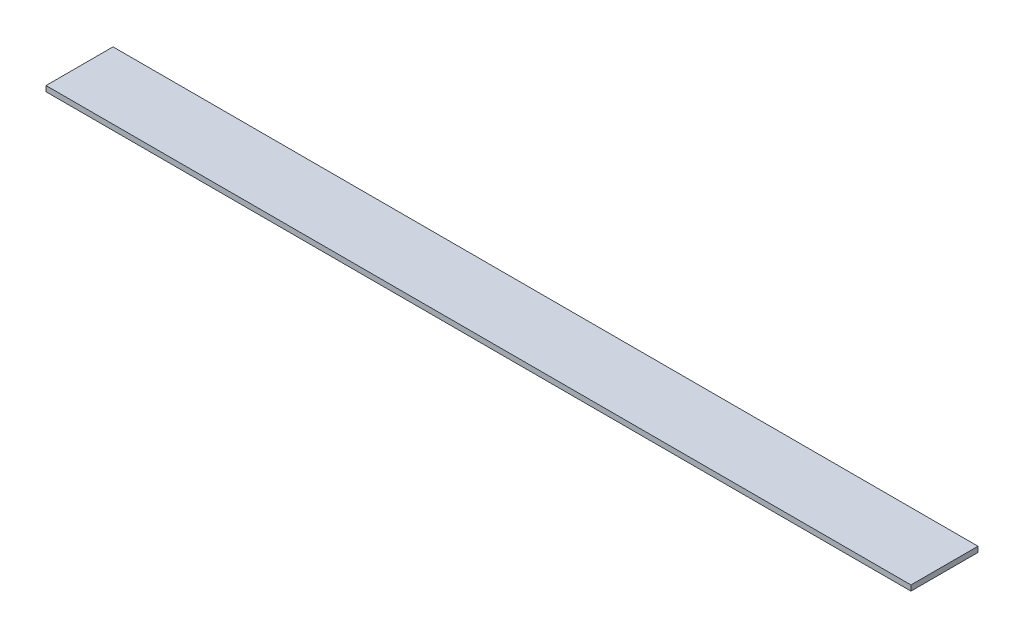
ISO-10303-21;
HEADER;
FILE_DESCRIPTION(('STEP AP214'),'2;1');
FILE_NAME('part.step','',(''),(''),'','','');
FILE_SCHEMA(('AUTOMOTIVE_DESIGN { 1 0 10303 214 1 1 1 1 }'));
ENDSEC;
DATA;
#1=APPLICATION_CONTEXT('core data for automotive mechanical design processes');
#2=APPLICATION_PROTOCOL_DEFINITION('international standard','automotive_design',2000,#1);
#3=PRODUCT_CONTEXT('',#1,'mechanical');
#4=PRODUCT('Part','Part','',(#3));
#5=PRODUCT_RELATED_PRODUCT_CATEGORY('part','',(#4));
#6=PRODUCT_DEFINITION_FORMATION('','',#4);
#7=PRODUCT_DEFINITION_CONTEXT('part definition',#1,'design');
#8=PRODUCT_DEFINITION('design','',#6,#7);
#9=PRODUCT_DEFINITION_SHAPE('','',#8);
#10=(LENGTH_UNIT() NAMED_UNIT(*) SI_UNIT(.MILLI.,.METRE.));
#11=(NAMED_UNIT(*) PLANE_ANGLE_UNIT() SI_UNIT($,.RADIAN.));
#12=(NAMED_UNIT(*) SI_UNIT($,.STERADIAN.) SOLID_ANGLE_UNIT());
#13=UNCERTAINTY_MEASURE_WITH_UNIT(LENGTH_MEASURE(1.E-05),#10,'distance_accuracy_value','');
#14=(GEOMETRIC_REPRESENTATION_CONTEXT(3) GLOBAL_UNCERTAINTY_ASSIGNED_CONTEXT((#13)) GLOBAL_UNIT_ASSIGNED_CONTEXT((#10,
#11,#12)) REPRESENTATION_CONTEXT('',''));
#15=CARTESIAN_POINT('',(0.,0.,0.));
#16=DIRECTION('',(0.,0.,1.));
#17=DIRECTION('',(1.,0.,0.));
#18=AXIS2_PLACEMENT_3D('',#15,#16,#17);
#19=CARTESIAN_POINT('',(254.,3.175,-19.685));
#20=DIRECTION('',(-1.,0.,0.));
#21=DIRECTION('',(0.,0.,1.));
#22=AXIS2_PLACEMENT_3D('',#19,#20,#21);
#23=PLANE('',#22);
#24=DIRECTION('',(0.,0.,-1.));
#25=VECTOR('',#24,1.);
#26=CARTESIAN_POINT('',(254.,0.,-19.685));
#27=LINE('',#26,#25);
#28=CARTESIAN_POINT('',(254.,0.,19.685));
#29=VERTEX_POINT('',#28);
#30=CARTESIAN_POINT('',(254.,0.,-19.685));
#31=VERTEX_POINT('',#30);
#32=EDGE_CURVE('E111',#29,#31,#27,.T.);
#33=ORIENTED_EDGE('',*,*,#32,.T.);
#34=DIRECTION('',(0.,-1.,0.));
#35=VECTOR('',#34,1.);
#36=CARTESIAN_POINT('',(254.,3.175,-19.685));
#37=LINE('',#36,#35);
#38=CARTESIAN_POINT('',(254.,3.175,-19.685));
#39=VERTEX_POINT('',#38);
#40=EDGE_CURVE('E11',#39,#31,#37,.T.);
#41=ORIENTED_EDGE('',*,*,#40,.F.);
#42=DIRECTION('',(0.,0.,-1.));
#43=VECTOR('',#42,1.);
#44=CARTESIAN_POINT('',(254.,3.175,-19.685));
#45=LINE('',#44,#43);
#46=CARTESIAN_POINT('',(254.,3.175,19.685));
#47=VERTEX_POINT('',#46);
#48=EDGE_CURVE('E95',#47,#39,#45,.T.);
#49=ORIENTED_EDGE('',*,*,#48,.F.);
#50=DIRECTION('',(0.,-1.,0.));
#51=VECTOR('',#50,1.);
#52=CARTESIAN_POINT('',(254.,3.175,19.685));
#53=LINE('',#52,#51);
#54=EDGE_CURVE('E107',#47,#29,#53,.T.);
#55=ORIENTED_EDGE('',*,*,#54,.T.);
#56=EDGE_LOOP('',(#33,#41,#49,#55));
#57=FACE_BOUND('',#56,.T.);
#58=ADVANCED_FACE('F43',(#57),#23,.F.);
#59=CARTESIAN_POINT('',(-254.,3.175,-19.685));
#60=DIRECTION('',(0.,0.,1.));
#61=DIRECTION('',(1.,0.,0.));
#62=AXIS2_PLACEMENT_3D('',#59,#60,#61);
#63=PLANE('',#62);
#64=DIRECTION('',(-1.,0.,0.));
#65=VECTOR('',#64,1.);
#66=CARTESIAN_POINT('',(-254.,0.,-19.685));
#67=LINE('',#66,#65);
#68=CARTESIAN_POINT('',(-254.,0.,-19.685));
#69=VERTEX_POINT('',#68);
#70=EDGE_CURVE('E100',#31,#69,#67,.T.);
#71=ORIENTED_EDGE('',*,*,#70,.T.);
#72=DIRECTION('',(0.,-1.,0.));
#73=VECTOR('',#72,1.);
#74=CARTESIAN_POINT('',(-254.,3.175,-19.685));
#75=LINE('',#74,#73);
#76=CARTESIAN_POINT('',(-254.,3.175,-19.685));
#77=VERTEX_POINT('',#76);
#78=EDGE_CURVE('E52',#77,#69,#75,.T.);
#79=ORIENTED_EDGE('',*,*,#78,.F.);
#80=DIRECTION('',(-1.,0.,0.));
#81=VECTOR('',#80,1.);
#82=CARTESIAN_POINT('',(-254.,3.175,-19.685));
#83=LINE('',#82,#81);
#84=EDGE_CURVE('E90',#39,#77,#83,.T.);
#85=ORIENTED_EDGE('',*,*,#84,.F.);
#86=ORIENTED_EDGE('',*,*,#40,.T.);
#87=EDGE_LOOP('',(#71,#79,#85,#86));
#88=FACE_BOUND('',#87,.T.);
#89=ADVANCED_FACE('F99',(#88),#63,.F.);
#90=CARTESIAN_POINT('',(-254.,3.175,-19.685));
#91=DIRECTION('',(1.,0.,0.));
#92=DIRECTION('',(0.,0.,-1.));
#93=AXIS2_PLACEMENT_3D('',#90,#91,#92);
#94=PLANE('',#93);
#95=DIRECTION('',(0.,0.,1.));
#96=VECTOR('',#95,1.);
#97=CARTESIAN_POINT('',(-254.,0.,-19.685));
#98=LINE('',#97,#96);
#99=CARTESIAN_POINT('',(-254.,0.,19.685));
#100=VERTEX_POINT('',#99);
#101=EDGE_CURVE('E77',#69,#100,#98,.T.);
#102=ORIENTED_EDGE('',*,*,#101,.T.);
#103=DIRECTION('',(0.,-1.,0.));
#104=VECTOR('',#103,1.);
#105=CARTESIAN_POINT('',(-254.,3.175,19.685));
#106=LINE('',#105,#104);
#107=CARTESIAN_POINT('',(-254.,3.175,19.685));
#108=VERTEX_POINT('',#107);
#109=EDGE_CURVE('E102',#108,#100,#106,.T.);
#110=ORIENTED_EDGE('',*,*,#109,.F.);
#111=DIRECTION('',(0.,0.,1.));
#112=VECTOR('',#111,1.);
#113=CARTESIAN_POINT('',(-254.,3.175,-19.685));
#114=LINE('',#113,#112);
#115=EDGE_CURVE('E93',#77,#108,#114,.T.);
#116=ORIENTED_EDGE('',*,*,#115,.F.);
#117=ORIENTED_EDGE('',*,*,#78,.T.);
#118=EDGE_LOOP('',(#102,#110,#116,#117));
#119=FACE_BOUND('',#118,.T.);
#120=ADVANCED_FACE('F103',(#119),#94,.F.);
#121=CARTESIAN_POINT('',(-254.,3.175,19.685));
#122=DIRECTION('',(0.,0.,-1.));
#123=DIRECTION('',(-1.,0.,0.));
#124=AXIS2_PLACEMENT_3D('',#121,#122,#123);
#125=PLANE('',#124);
#126=DIRECTION('',(1.,0.,0.));
#127=VECTOR('',#126,1.);
#128=CARTESIAN_POINT('',(-254.,0.,19.685));
#129=LINE('',#128,#127);
#130=EDGE_CURVE('E83',#100,#29,#129,.T.);
#131=ORIENTED_EDGE('',*,*,#130,.T.);
#132=ORIENTED_EDGE('',*,*,#54,.F.);
#133=DIRECTION('',(1.,0.,0.));
#134=VECTOR('',#133,1.);
#135=CARTESIAN_POINT('',(-254.,3.175,19.685));
#136=LINE('',#135,#134);
#137=EDGE_CURVE('E60',#108,#47,#136,.T.);
#138=ORIENTED_EDGE('',*,*,#137,.F.);
#139=ORIENTED_EDGE('',*,*,#109,.T.);
#140=EDGE_LOOP('',(#131,#132,#138,#139));
#141=FACE_BOUND('',#140,.T.);
#142=ADVANCED_FACE('F124',(#141),#125,.F.);
#143=CARTESIAN_POINT('',(0.,3.175,0.));
#144=DIRECTION('',(0.,1.,0.));
#145=DIRECTION('',(0.,0.,1.));
#146=AXIS2_PLACEMENT_3D('',#143,#144,#145);
#147=PLANE('',#146);
#148=ORIENTED_EDGE('',*,*,#48,.T.);
#149=ORIENTED_EDGE('',*,*,#84,.T.);
#150=ORIENTED_EDGE('',*,*,#115,.T.);
#151=ORIENTED_EDGE('',*,*,#137,.T.);
#152=EDGE_LOOP('',(#148,#149,#150,#151));
#153=FACE_BOUND('',#152,.T.);
#154=ADVANCED_FACE('F91',(#153),#147,.T.);
#155=CARTESIAN_POINT('',(0.,0.,0.));
#156=DIRECTION('',(0.,1.,0.));
#157=DIRECTION('',(0.,0.,1.));
#158=AXIS2_PLACEMENT_3D('',#155,#156,#157);
#159=PLANE('',#158);
#160=ORIENTED_EDGE('',*,*,#32,.F.);
#161=ORIENTED_EDGE('',*,*,#130,.F.);
#162=ORIENTED_EDGE('',*,*,#101,.F.);
#163=ORIENTED_EDGE('',*,*,#70,.F.);
#164=EDGE_LOOP('',(#160,#161,#162,#163));
#165=FACE_BOUND('',#164,.T.);
#166=ADVANCED_FACE('F127',(#165),#159,.F.);
#167=CLOSED_SHELL('',(#58,#89,#120,#142,#154,#166));
#168=MANIFOLD_SOLID_BREP('B2',#167);
#169=ADVANCED_BREP_SHAPE_REPRESENTATION('',(#18,#168),#14);
#170=SHAPE_DEFINITION_REPRESENTATION(#9,#169);
ENDSEC;
END-ISO-10303-21;
